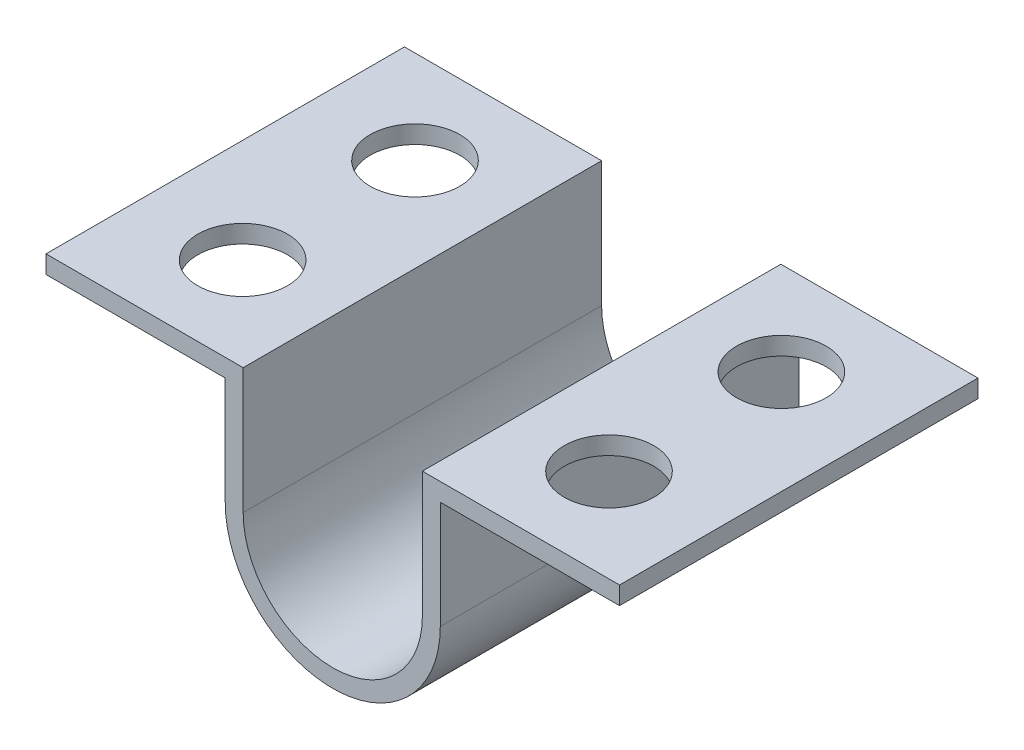
ISO-10303-21;
HEADER;
FILE_DESCRIPTION(('STEP AP214'),'2;1');
FILE_NAME('part.step','',(''),(''),'','','');
FILE_SCHEMA(('AUTOMOTIVE_DESIGN { 1 0 10303 214 1 1 1 1 }'));
ENDSEC;
DATA;
#1=APPLICATION_CONTEXT('core data for automotive mechanical design processes');
#2=APPLICATION_PROTOCOL_DEFINITION('international standard','automotive_design',2000,#1);
#3=PRODUCT_CONTEXT('',#1,'mechanical');
#4=PRODUCT('Part','Part','',(#3));
#5=PRODUCT_RELATED_PRODUCT_CATEGORY('part','',(#4));
#6=PRODUCT_DEFINITION_FORMATION('','',#4);
#7=PRODUCT_DEFINITION_CONTEXT('part definition',#1,'design');
#8=PRODUCT_DEFINITION('design','',#6,#7);
#9=PRODUCT_DEFINITION_SHAPE('','',#8);
#10=(LENGTH_UNIT() NAMED_UNIT(*) SI_UNIT(.MILLI.,.METRE.));
#11=(NAMED_UNIT(*) PLANE_ANGLE_UNIT() SI_UNIT($,.RADIAN.));
#12=(NAMED_UNIT(*) SI_UNIT($,.STERADIAN.) SOLID_ANGLE_UNIT());
#13=UNCERTAINTY_MEASURE_WITH_UNIT(LENGTH_MEASURE(1.E-05),#10,'distance_accuracy_value','');
#14=(GEOMETRIC_REPRESENTATION_CONTEXT(3) GLOBAL_UNCERTAINTY_ASSIGNED_CONTEXT((#13)) GLOBAL_UNIT_ASSIGNED_CONTEXT((#10,
#11,#12)) REPRESENTATION_CONTEXT('',''));
#15=CARTESIAN_POINT('',(0.,0.,0.));
#16=DIRECTION('',(0.,0.,1.));
#17=DIRECTION('',(1.,0.,0.));
#18=AXIS2_PLACEMENT_3D('',#15,#16,#17);
#19=CARTESIAN_POINT('',(-11.,0.5,10.));
#20=DIRECTION('',(0.,-1.,0.));
#21=DIRECTION('',(1.,0.,0.));
#22=AXIS2_PLACEMENT_3D('',#19,#20,#21);
#23=PLANE('',#22);
#24=CARTESIAN_POINT('',(-13.1104213238898,0.5,7.40424635587817));
#25=DIRECTION('',(0.,-1.,0.));
#26=DIRECTION('',(0.,0.,-1.));
#27=AXIS2_PLACEMENT_3D('',#24,#25,#26);
#28=CIRCLE('',#27,1.25);
#29=CARTESIAN_POINT('',(-13.1104213238898,0.5,6.15424635587817));
#30=VERTEX_POINT('',#29);
#31=EDGE_CURVE('E314',#30,#30,#28,.T.);
#32=ORIENTED_EDGE('',*,*,#31,.T.);
#33=EDGE_LOOP('',(#32));
#34=FACE_BOUND('',#33,.T.);
#35=CARTESIAN_POINT('',(-13.1104213238898,0.5,2.59575364412183));
#36=DIRECTION('',(0.,1.,0.));
#37=DIRECTION('',(0.,0.,1.));
#38=AXIS2_PLACEMENT_3D('',#35,#36,#37);
#39=CIRCLE('',#38,1.25);
#40=CARTESIAN_POINT('',(-13.1104213238898,0.5,3.84575364412183));
#41=VERTEX_POINT('',#40);
#42=EDGE_CURVE('E172',#41,#41,#39,.T.);
#43=ORIENTED_EDGE('',*,*,#42,.F.);
#44=EDGE_LOOP('',(#43));
#45=FACE_BOUND('',#44,.T.);
#46=DIRECTION('',(-1.,0.,0.));
#47=VECTOR('',#46,1.);
#48=CARTESIAN_POINT('',(-11.,0.5,0.));
#49=LINE('',#48,#47);
#50=CARTESIAN_POINT('',(-10.5,0.5,0.));
#51=VERTEX_POINT('',#50);
#52=CARTESIAN_POINT('',(-16.,0.499999999999999,0.));
#53=VERTEX_POINT('',#52);
#54=EDGE_CURVE('E167',#51,#53,#49,.T.);
#55=ORIENTED_EDGE('',*,*,#54,.T.);
#56=DIRECTION('',(0.,0.,-1.));
#57=VECTOR('',#56,1.);
#58=CARTESIAN_POINT('',(-16.,0.499999999999999,10.));
#59=LINE('',#58,#57);
#60=CARTESIAN_POINT('',(-16.,0.499999999999999,10.));
#61=VERTEX_POINT('',#60);
#62=EDGE_CURVE('E11',#61,#53,#59,.T.);
#63=ORIENTED_EDGE('',*,*,#62,.F.);
#64=DIRECTION('',(-1.,0.,0.));
#65=VECTOR('',#64,1.);
#66=CARTESIAN_POINT('',(-11.,0.5,10.));
#67=LINE('',#66,#65);
#68=CARTESIAN_POINT('',(-10.5,0.5,10.));
#69=VERTEX_POINT('',#68);
#70=EDGE_CURVE('E111',#69,#61,#67,.T.);
#71=ORIENTED_EDGE('',*,*,#70,.F.);
#72=DIRECTION('',(0.,0.,-1.));
#73=VECTOR('',#72,1.);
#74=CARTESIAN_POINT('',(-10.5,0.5,10.));
#75=LINE('',#74,#73);
#76=EDGE_CURVE('E163',#69,#51,#75,.T.);
#77=ORIENTED_EDGE('',*,*,#76,.T.);
#78=EDGE_LOOP('',(#55,#63,#71,#77));
#79=FACE_BOUND('',#78,.T.);
#80=ADVANCED_FACE('F42',(#34,#45,#79),#23,.F.);
#81=CARTESIAN_POINT('',(-16.,0.,10.));
#82=DIRECTION('',(-1.,0.,0.));
#83=DIRECTION('',(0.,0.,1.));
#84=AXIS2_PLACEMENT_3D('',#81,#82,#83);
#85=PLANE('',#84);
#86=DIRECTION('',(0.,1.,0.));
#87=VECTOR('',#86,1.);
#88=CARTESIAN_POINT('',(-16.,0.,0.));
#89=LINE('',#88,#87);
#90=CARTESIAN_POINT('',(-16.,0.,0.));
#91=VERTEX_POINT('',#90);
#92=EDGE_CURVE('E171',#91,#53,#89,.T.);
#93=ORIENTED_EDGE('',*,*,#92,.F.);
#94=DIRECTION('',(0.,0.,-1.));
#95=VECTOR('',#94,1.);
#96=CARTESIAN_POINT('',(-16.,0.,10.));
#97=LINE('',#96,#95);
#98=CARTESIAN_POINT('',(-16.,0.,10.));
#99=VERTEX_POINT('',#98);
#100=EDGE_CURVE('E51',#99,#91,#97,.T.);
#101=ORIENTED_EDGE('',*,*,#100,.F.);
#102=DIRECTION('',(0.,1.,0.));
#103=VECTOR('',#102,1.);
#104=CARTESIAN_POINT('',(-16.,0.,10.));
#105=LINE('',#104,#103);
#106=EDGE_CURVE('E255',#99,#61,#105,.T.);
#107=ORIENTED_EDGE('',*,*,#106,.T.);
#108=ORIENTED_EDGE('',*,*,#62,.T.);
#109=EDGE_LOOP('',(#93,#101,#107,#108));
#110=FACE_BOUND('',#109,.T.);
#111=ADVANCED_FACE('F242',(#110),#85,.T.);
#112=CARTESIAN_POINT('',(-11.,0.,10.));
#113=DIRECTION('',(0.,-1.,0.));
#114=DIRECTION('',(1.,0.,0.));
#115=AXIS2_PLACEMENT_3D('',#112,#113,#114);
#116=PLANE('',#115);
#117=CARTESIAN_POINT('',(-13.1104213238898,0.,7.40424635587817));
#118=DIRECTION('',(0.,-1.,0.));
#119=DIRECTION('',(0.,0.,-1.));
#120=AXIS2_PLACEMENT_3D('',#117,#118,#119);
#121=CIRCLE('',#120,1.25);
#122=CARTESIAN_POINT('',(-13.1104213238898,0.,6.15424635587817));
#123=VERTEX_POINT('',#122);
#124=EDGE_CURVE('E362',#123,#123,#121,.T.);
#125=ORIENTED_EDGE('',*,*,#124,.F.);
#126=EDGE_LOOP('',(#125));
#127=FACE_BOUND('',#126,.T.);
#128=CARTESIAN_POINT('',(-13.1104213238898,0.,2.59575364412183));
#129=DIRECTION('',(0.,1.,0.));
#130=DIRECTION('',(0.,0.,1.));
#131=AXIS2_PLACEMENT_3D('',#128,#129,#130);
#132=CIRCLE('',#131,1.25);
#133=CARTESIAN_POINT('',(-13.1104213238898,0.,3.84575364412183));
#134=VERTEX_POINT('',#133);
#135=EDGE_CURVE('E368',#134,#134,#132,.T.);
#136=ORIENTED_EDGE('',*,*,#135,.T.);
#137=EDGE_LOOP('',(#136));
#138=FACE_BOUND('',#137,.T.);
#139=DIRECTION('',(-1.,0.,0.));
#140=VECTOR('',#139,1.);
#141=CARTESIAN_POINT('',(-11.,0.,0.));
#142=LINE('',#141,#140);
#143=CARTESIAN_POINT('',(-11.,0.,0.));
#144=VERTEX_POINT('',#143);
#145=EDGE_CURVE('E176',#144,#91,#142,.T.);
#146=ORIENTED_EDGE('',*,*,#145,.F.);
#147=DIRECTION('',(0.,0.,-1.));
#148=VECTOR('',#147,1.);
#149=CARTESIAN_POINT('',(-11.,0.,10.));
#150=LINE('',#149,#148);
#151=CARTESIAN_POINT('',(-11.,0.,10.));
#152=VERTEX_POINT('',#151);
#153=EDGE_CURVE('E230',#152,#144,#150,.T.);
#154=ORIENTED_EDGE('',*,*,#153,.F.);
#155=DIRECTION('',(-1.,0.,0.));
#156=VECTOR('',#155,1.);
#157=CARTESIAN_POINT('',(-11.,0.,10.));
#158=LINE('',#157,#156);
#159=EDGE_CURVE('E239',#152,#99,#158,.T.);
#160=ORIENTED_EDGE('',*,*,#159,.T.);
#161=ORIENTED_EDGE('',*,*,#100,.T.);
#162=EDGE_LOOP('',(#146,#154,#160,#161));
#163=FACE_BOUND('',#162,.T.);
#164=ADVANCED_FACE('F237',(#127,#138,#163),#116,.T.);
#165=CARTESIAN_POINT('',(-11.,-3.,10.));
#166=DIRECTION('',(-1.,0.,0.));
#167=DIRECTION('',(0.,0.,1.));
#168=AXIS2_PLACEMENT_3D('',#165,#166,#167);
#169=PLANE('',#168);
#170=DIRECTION('',(0.,1.,0.));
#171=VECTOR('',#170,1.);
#172=CARTESIAN_POINT('',(-11.,-3.,0.));
#173=LINE('',#172,#171);
#174=CARTESIAN_POINT('',(-11.,-3.,0.));
#175=VERTEX_POINT('',#174);
#176=EDGE_CURVE('E180',#175,#144,#173,.T.);
#177=ORIENTED_EDGE('',*,*,#176,.F.);
#178=DIRECTION('',(0.,0.,-1.));
#179=VECTOR('',#178,1.);
#180=CARTESIAN_POINT('',(-11.,-3.,10.));
#181=LINE('',#180,#179);
#182=CARTESIAN_POINT('',(-11.,-3.,10.));
#183=VERTEX_POINT('',#182);
#184=EDGE_CURVE('E227',#183,#175,#181,.T.);
#185=ORIENTED_EDGE('',*,*,#184,.F.);
#186=DIRECTION('',(0.,1.,0.));
#187=VECTOR('',#186,1.);
#188=CARTESIAN_POINT('',(-11.,-3.,10.));
#189=LINE('',#188,#187);
#190=EDGE_CURVE('E252',#183,#152,#189,.T.);
#191=ORIENTED_EDGE('',*,*,#190,.T.);
#192=ORIENTED_EDGE('',*,*,#153,.T.);
#193=EDGE_LOOP('',(#177,#185,#191,#192));
#194=FACE_BOUND('',#193,.T.);
#195=ADVANCED_FACE('F249',(#194),#169,.T.);
#196=CARTESIAN_POINT('',(-8.,-3.,10.));
#197=DIRECTION('',(0.,0.,-1.));
#198=DIRECTION('',(-1.,0.,0.));
#199=AXIS2_PLACEMENT_3D('',#196,#197,#198);
#200=CYLINDRICAL_SURFACE('',#199,3.);
#201=CARTESIAN_POINT('',(-8.,-3.,0.));
#202=DIRECTION('',(0.,0.,-1.));
#203=DIRECTION('',(-1.,0.,0.));
#204=AXIS2_PLACEMENT_3D('',#201,#202,#203);
#205=CIRCLE('',#204,3.);
#206=CARTESIAN_POINT('',(-5.,-3.,0.));
#207=VERTEX_POINT('',#206);
#208=EDGE_CURVE('E184',#207,#175,#205,.T.);
#209=ORIENTED_EDGE('',*,*,#208,.F.);
#210=DIRECTION('',(0.,0.,-1.));
#211=VECTOR('',#210,1.);
#212=CARTESIAN_POINT('',(-5.,-3.,10.));
#213=LINE('',#212,#211);
#214=CARTESIAN_POINT('',(-5.,-3.,10.));
#215=VERTEX_POINT('',#214);
#216=EDGE_CURVE('E224',#215,#207,#213,.T.);
#217=ORIENTED_EDGE('',*,*,#216,.F.);
#218=CARTESIAN_POINT('',(-8.,-3.,10.));
#219=DIRECTION('',(0.,0.,-1.));
#220=DIRECTION('',(-1.,0.,0.));
#221=AXIS2_PLACEMENT_3D('',#218,#219,#220);
#222=CIRCLE('',#221,3.);
#223=EDGE_CURVE('E260',#215,#183,#222,.T.);
#224=ORIENTED_EDGE('',*,*,#223,.T.);
#225=ORIENTED_EDGE('',*,*,#184,.T.);
#226=EDGE_LOOP('',(#209,#217,#224,#225));
#227=FACE_BOUND('',#226,.T.);
#228=ADVANCED_FACE('F385',(#227),#200,.T.);
#229=CARTESIAN_POINT('',(-5.,0.,10.));
#230=DIRECTION('',(1.,0.,0.));
#231=DIRECTION('',(0.,1.,0.));
#232=AXIS2_PLACEMENT_3D('',#229,#230,#231);
#233=PLANE('',#232);
#234=DIRECTION('',(0.,-1.,0.));
#235=VECTOR('',#234,1.);
#236=CARTESIAN_POINT('',(-5.,0.,0.));
#237=LINE('',#236,#235);
#238=CARTESIAN_POINT('',(-5.,0.,0.));
#239=VERTEX_POINT('',#238);
#240=EDGE_CURVE('E188',#239,#207,#237,.T.);
#241=ORIENTED_EDGE('',*,*,#240,.F.);
#242=DIRECTION('',(0.,0.,-1.));
#243=VECTOR('',#242,1.);
#244=CARTESIAN_POINT('',(-5.,0.,10.));
#245=LINE('',#244,#243);
#246=CARTESIAN_POINT('',(-5.,0.,10.));
#247=VERTEX_POINT('',#246);
#248=EDGE_CURVE('E221',#247,#239,#245,.T.);
#249=ORIENTED_EDGE('',*,*,#248,.F.);
#250=DIRECTION('',(0.,-1.,0.));
#251=VECTOR('',#250,1.);
#252=CARTESIAN_POINT('',(-5.,0.,10.));
#253=LINE('',#252,#251);
#254=EDGE_CURVE('E267',#247,#215,#253,.T.);
#255=ORIENTED_EDGE('',*,*,#254,.T.);
#256=ORIENTED_EDGE('',*,*,#216,.T.);
#257=EDGE_LOOP('',(#241,#249,#255,#256));
#258=FACE_BOUND('',#257,.T.);
#259=ADVANCED_FACE('F391',(#258),#233,.T.);
#260=CARTESIAN_POINT('',(0.,0.,10.));
#261=DIRECTION('',(0.,-1.,0.));
#262=DIRECTION('',(1.,0.,0.));
#263=AXIS2_PLACEMENT_3D('',#260,#261,#262);
#264=PLANE('',#263);
#265=CARTESIAN_POINT('',(-2.88957867611016,0.,7.40424635587817));
#266=DIRECTION('',(0.,1.,0.));
#267=DIRECTION('',(0.,0.,-1.));
#268=AXIS2_PLACEMENT_3D('',#265,#266,#267);
#269=CIRCLE('',#268,1.25);
#270=CARTESIAN_POINT('',(-2.88957867611016,0.,6.15424635587817));
#271=VERTEX_POINT('',#270);
#272=EDGE_CURVE('E350',#271,#271,#269,.T.);
#273=ORIENTED_EDGE('',*,*,#272,.T.);
#274=EDGE_LOOP('',(#273));
#275=FACE_BOUND('',#274,.T.);
#276=CARTESIAN_POINT('',(-2.88957867611016,0.,2.59575364412183));
#277=DIRECTION('',(0.,-1.,0.));
#278=DIRECTION('',(0.,0.,1.));
#279=AXIS2_PLACEMENT_3D('',#276,#277,#278);
#280=CIRCLE('',#279,1.25);
#281=CARTESIAN_POINT('',(-2.88957867611016,0.,3.84575364412183));
#282=VERTEX_POINT('',#281);
#283=EDGE_CURVE('E355',#282,#282,#280,.T.);
#284=ORIENTED_EDGE('',*,*,#283,.F.);
#285=EDGE_LOOP('',(#284));
#286=FACE_BOUND('',#285,.T.);
#287=DIRECTION('',(-1.,0.,0.));
#288=VECTOR('',#287,1.);
#289=CARTESIAN_POINT('',(0.,0.,0.));
#290=LINE('',#289,#288);
#291=CARTESIAN_POINT('',(0.,0.,0.));
#292=VERTEX_POINT('',#291);
#293=EDGE_CURVE('E192',#292,#239,#290,.T.);
#294=ORIENTED_EDGE('',*,*,#293,.F.);
#295=DIRECTION('',(0.,0.,-1.));
#296=VECTOR('',#295,1.);
#297=CARTESIAN_POINT('',(0.,0.,10.));
#298=LINE('',#297,#296);
#299=CARTESIAN_POINT('',(0.,0.,10.));
#300=VERTEX_POINT('',#299);
#301=EDGE_CURVE('E218',#300,#292,#298,.T.);
#302=ORIENTED_EDGE('',*,*,#301,.F.);
#303=DIRECTION('',(-1.,0.,0.));
#304=VECTOR('',#303,1.);
#305=CARTESIAN_POINT('',(0.,0.,10.));
#306=LINE('',#305,#304);
#307=EDGE_CURVE('E271',#300,#247,#306,.T.);
#308=ORIENTED_EDGE('',*,*,#307,.T.);
#309=ORIENTED_EDGE('',*,*,#248,.T.);
#310=EDGE_LOOP('',(#294,#302,#308,#309));
#311=FACE_BOUND('',#310,.T.);
#312=ADVANCED_FACE('F286',(#275,#286,#311),#264,.T.);
#313=CARTESIAN_POINT('',(0.,0.5,10.));
#314=DIRECTION('',(1.,0.,0.));
#315=DIRECTION('',(0.,1.,0.));
#316=AXIS2_PLACEMENT_3D('',#313,#314,#315);
#317=PLANE('',#316);
#318=DIRECTION('',(0.,-1.,0.));
#319=VECTOR('',#318,1.);
#320=CARTESIAN_POINT('',(0.,0.5,0.));
#321=LINE('',#320,#319);
#322=CARTESIAN_POINT('',(0.,0.5,0.));
#323=VERTEX_POINT('',#322);
#324=EDGE_CURVE('E196',#323,#292,#321,.T.);
#325=ORIENTED_EDGE('',*,*,#324,.F.);
#326=DIRECTION('',(0.,0.,-1.));
#327=VECTOR('',#326,1.);
#328=CARTESIAN_POINT('',(0.,0.5,10.));
#329=LINE('',#328,#327);
#330=CARTESIAN_POINT('',(0.,0.5,10.));
#331=VERTEX_POINT('',#330);
#332=EDGE_CURVE('E215',#331,#323,#329,.T.);
#333=ORIENTED_EDGE('',*,*,#332,.F.);
#334=DIRECTION('',(0.,-1.,0.));
#335=VECTOR('',#334,1.);
#336=CARTESIAN_POINT('',(0.,0.5,10.));
#337=LINE('',#336,#335);
#338=EDGE_CURVE('E275',#331,#300,#337,.T.);
#339=ORIENTED_EDGE('',*,*,#338,.T.);
#340=ORIENTED_EDGE('',*,*,#301,.T.);
#341=EDGE_LOOP('',(#325,#333,#339,#340));
#342=FACE_BOUND('',#341,.T.);
#343=ADVANCED_FACE('F281',(#342),#317,.T.);
#344=CARTESIAN_POINT('',(0.,0.5,10.));
#345=DIRECTION('',(0.,-1.,0.));
#346=DIRECTION('',(1.,0.,0.));
#347=AXIS2_PLACEMENT_3D('',#344,#345,#346);
#348=PLANE('',#347);
#349=CARTESIAN_POINT('',(-2.88957867611016,0.5,7.40424635587817));
#350=DIRECTION('',(0.,1.,0.));
#351=DIRECTION('',(0.,0.,-1.));
#352=AXIS2_PLACEMENT_3D('',#349,#350,#351);
#353=CIRCLE('',#352,1.25);
#354=CARTESIAN_POINT('',(-2.88957867611016,0.5,6.15424635587817));
#355=VERTEX_POINT('',#354);
#356=EDGE_CURVE('E347',#355,#355,#353,.T.);
#357=ORIENTED_EDGE('',*,*,#356,.F.);
#358=EDGE_LOOP('',(#357));
#359=FACE_BOUND('',#358,.T.);
#360=CARTESIAN_POINT('',(-2.88957867611016,0.5,2.59575364412183));
#361=DIRECTION('',(0.,-1.,0.));
#362=DIRECTION('',(0.,0.,1.));
#363=AXIS2_PLACEMENT_3D('',#360,#361,#362);
#364=CIRCLE('',#363,1.25);
#365=CARTESIAN_POINT('',(-2.88957867611016,0.5,3.84575364412183));
#366=VERTEX_POINT('',#365);
#367=EDGE_CURVE('E358',#366,#366,#364,.T.);
#368=ORIENTED_EDGE('',*,*,#367,.T.);
#369=EDGE_LOOP('',(#368));
#370=FACE_BOUND('',#369,.T.);
#371=DIRECTION('',(-1.,0.,0.));
#372=VECTOR('',#371,1.);
#373=CARTESIAN_POINT('',(0.,0.5,0.));
#374=LINE('',#373,#372);
#375=CARTESIAN_POINT('',(-5.5,0.499999999999999,0.));
#376=VERTEX_POINT('',#375);
#377=EDGE_CURVE('E200',#323,#376,#374,.T.);
#378=ORIENTED_EDGE('',*,*,#377,.T.);
#379=DIRECTION('',(0.,0.,-1.));
#380=VECTOR('',#379,1.);
#381=CARTESIAN_POINT('',(-5.5,0.499999999999999,10.));
#382=LINE('',#381,#380);
#383=CARTESIAN_POINT('',(-5.5,0.499999999999999,10.));
#384=VERTEX_POINT('',#383);
#385=EDGE_CURVE('E156',#384,#376,#382,.T.);
#386=ORIENTED_EDGE('',*,*,#385,.F.);
#387=DIRECTION('',(-1.,0.,0.));
#388=VECTOR('',#387,1.);
#389=CARTESIAN_POINT('',(0.,0.5,10.));
#390=LINE('',#389,#388);
#391=EDGE_CURVE('E145',#331,#384,#390,.T.);
#392=ORIENTED_EDGE('',*,*,#391,.F.);
#393=ORIENTED_EDGE('',*,*,#332,.T.);
#394=EDGE_LOOP('',(#378,#386,#392,#393));
#395=FACE_BOUND('',#394,.T.);
#396=ADVANCED_FACE('F290',(#359,#370,#395),#348,.F.);
#397=CARTESIAN_POINT('',(-5.5,0.,10.));
#398=DIRECTION('',(1.,0.,0.));
#399=DIRECTION('',(0.,1.,0.));
#400=AXIS2_PLACEMENT_3D('',#397,#398,#399);
#401=PLANE('',#400);
#402=DIRECTION('',(0.,-1.,0.));
#403=VECTOR('',#402,1.);
#404=CARTESIAN_POINT('',(-5.5,0.,0.));
#405=LINE('',#404,#403);
#406=CARTESIAN_POINT('',(-5.5,-3.,0.));
#407=VERTEX_POINT('',#406);
#408=EDGE_CURVE('E154',#376,#407,#405,.T.);
#409=ORIENTED_EDGE('',*,*,#408,.T.);
#410=DIRECTION('',(0.,0.,-1.));
#411=VECTOR('',#410,1.);
#412=CARTESIAN_POINT('',(-5.5,-3.,10.));
#413=LINE('',#412,#411);
#414=CARTESIAN_POINT('',(-5.5,-3.,10.));
#415=VERTEX_POINT('',#414);
#416=EDGE_CURVE('E151',#415,#407,#413,.T.);
#417=ORIENTED_EDGE('',*,*,#416,.F.);
#418=DIRECTION('',(0.,-1.,0.));
#419=VECTOR('',#418,1.);
#420=CARTESIAN_POINT('',(-5.5,0.,10.));
#421=LINE('',#420,#419);
#422=EDGE_CURVE('E138',#384,#415,#421,.T.);
#423=ORIENTED_EDGE('',*,*,#422,.F.);
#424=ORIENTED_EDGE('',*,*,#385,.T.);
#425=EDGE_LOOP('',(#409,#417,#423,#424));
#426=FACE_BOUND('',#425,.T.);
#427=ADVANCED_FACE('F152',(#426),#401,.F.);
#428=CARTESIAN_POINT('',(-8.,-3.,10.));
#429=DIRECTION('',(0.,0.,-1.));
#430=DIRECTION('',(-1.,0.,0.));
#431=AXIS2_PLACEMENT_3D('',#428,#429,#430);
#432=CYLINDRICAL_SURFACE('',#431,2.5);
#433=CARTESIAN_POINT('',(-8.,-3.,0.));
#434=DIRECTION('',(0.,0.,1.));
#435=DIRECTION('',(1.,0.,0.));
#436=AXIS2_PLACEMENT_3D('',#433,#434,#435);
#437=CIRCLE('',#436,2.5);
#438=CARTESIAN_POINT('',(-10.5,-3.,0.));
#439=VERTEX_POINT('',#438);
#440=EDGE_CURVE('E99',#407,#439,#437,.F.);
#441=ORIENTED_EDGE('',*,*,#440,.T.);
#442=DIRECTION('',(0.,0.,-1.));
#443=VECTOR('',#442,1.);
#444=CARTESIAN_POINT('',(-10.5,-3.,10.));
#445=LINE('',#444,#443);
#446=CARTESIAN_POINT('',(-10.5,-3.,10.));
#447=VERTEX_POINT('',#446);
#448=EDGE_CURVE('E157',#447,#439,#445,.T.);
#449=ORIENTED_EDGE('',*,*,#448,.F.);
#450=CARTESIAN_POINT('',(-8.,-3.,10.));
#451=DIRECTION('',(0.,0.,1.));
#452=DIRECTION('',(1.,0.,0.));
#453=AXIS2_PLACEMENT_3D('',#450,#451,#452);
#454=CIRCLE('',#453,2.5);
#455=EDGE_CURVE('E142',#415,#447,#454,.F.);
#456=ORIENTED_EDGE('',*,*,#455,.F.);
#457=ORIENTED_EDGE('',*,*,#416,.T.);
#458=EDGE_LOOP('',(#441,#449,#456,#457));
#459=FACE_BOUND('',#458,.T.);
#460=ADVANCED_FACE('F159',(#459),#432,.F.);
#461=CARTESIAN_POINT('',(-10.5,-3.,10.));
#462=DIRECTION('',(-1.,0.,0.));
#463=DIRECTION('',(0.,0.,1.));
#464=AXIS2_PLACEMENT_3D('',#461,#462,#463);
#465=PLANE('',#464);
#466=DIRECTION('',(0.,1.,0.));
#467=VECTOR('',#466,1.);
#468=CARTESIAN_POINT('',(-10.5,-3.,0.));
#469=LINE('',#468,#467);
#470=EDGE_CURVE('E105',#439,#51,#469,.T.);
#471=ORIENTED_EDGE('',*,*,#470,.T.);
#472=ORIENTED_EDGE('',*,*,#76,.F.);
#473=DIRECTION('',(0.,1.,0.));
#474=VECTOR('',#473,1.);
#475=CARTESIAN_POINT('',(-10.5,-3.,10.));
#476=LINE('',#475,#474);
#477=EDGE_CURVE('E59',#447,#69,#476,.T.);
#478=ORIENTED_EDGE('',*,*,#477,.F.);
#479=ORIENTED_EDGE('',*,*,#448,.T.);
#480=EDGE_LOOP('',(#471,#472,#478,#479));
#481=FACE_BOUND('',#480,.T.);
#482=ADVANCED_FACE('F318',(#481),#465,.F.);
#483=CARTESIAN_POINT('',(-8.,-3.,10.));
#484=DIRECTION('',(0.,0.,-1.));
#485=DIRECTION('',(-1.,0.,0.));
#486=AXIS2_PLACEMENT_3D('',#483,#484,#485);
#487=PLANE('',#486);
#488=ORIENTED_EDGE('',*,*,#70,.T.);
#489=ORIENTED_EDGE('',*,*,#106,.F.);
#490=ORIENTED_EDGE('',*,*,#159,.F.);
#491=ORIENTED_EDGE('',*,*,#190,.F.);
#492=ORIENTED_EDGE('',*,*,#223,.F.);
#493=ORIENTED_EDGE('',*,*,#254,.F.);
#494=ORIENTED_EDGE('',*,*,#307,.F.);
#495=ORIENTED_EDGE('',*,*,#338,.F.);
#496=ORIENTED_EDGE('',*,*,#391,.T.);
#497=ORIENTED_EDGE('',*,*,#422,.T.);
#498=ORIENTED_EDGE('',*,*,#455,.T.);
#499=ORIENTED_EDGE('',*,*,#477,.T.);
#500=EDGE_LOOP('',(#488,#489,#490,#491,#492,#493,#494,#495,#496,#497,#498,#499));
#501=FACE_BOUND('',#500,.T.);
#502=ADVANCED_FACE('F140',(#501),#487,.F.);
#503=CARTESIAN_POINT('',(-8.,-3.,0.));
#504=DIRECTION('',(0.,0.,-1.));
#505=DIRECTION('',(-1.,0.,0.));
#506=AXIS2_PLACEMENT_3D('',#503,#504,#505);
#507=PLANE('',#506);
#508=ORIENTED_EDGE('',*,*,#54,.F.);
#509=ORIENTED_EDGE('',*,*,#470,.F.);
#510=ORIENTED_EDGE('',*,*,#440,.F.);
#511=ORIENTED_EDGE('',*,*,#408,.F.);
#512=ORIENTED_EDGE('',*,*,#377,.F.);
#513=ORIENTED_EDGE('',*,*,#324,.T.);
#514=ORIENTED_EDGE('',*,*,#293,.T.);
#515=ORIENTED_EDGE('',*,*,#240,.T.);
#516=ORIENTED_EDGE('',*,*,#208,.T.);
#517=ORIENTED_EDGE('',*,*,#176,.T.);
#518=ORIENTED_EDGE('',*,*,#145,.T.);
#519=ORIENTED_EDGE('',*,*,#92,.T.);
#520=EDGE_LOOP('',(#508,#509,#510,#511,#512,#513,#514,#515,#516,#517,#518,#519));
#521=FACE_BOUND('',#520,.T.);
#522=ADVANCED_FACE('F245',(#521),#507,.T.);
#523=CARTESIAN_POINT('',(-13.1104213238898,0.5,2.59575364412183));
#524=DIRECTION('',(0.,-1.,0.));
#525=DIRECTION('',(0.,0.,-1.));
#526=AXIS2_PLACEMENT_3D('',#523,#524,#525);
#527=CYLINDRICAL_SURFACE('',#526,1.25);
#528=ORIENTED_EDGE('',*,*,#42,.T.);
#529=EDGE_LOOP('',(#528));
#530=FACE_BOUND('',#529,.T.);
#531=ORIENTED_EDGE('',*,*,#135,.F.);
#532=EDGE_LOOP('',(#531));
#533=FACE_BOUND('',#532,.T.);
#534=ADVANCED_FACE('F329',(#530,#533),#527,.F.);
#535=CARTESIAN_POINT('',(-13.1104213238898,0.5,7.40424635587817));
#536=DIRECTION('',(0.,-1.,0.));
#537=DIRECTION('',(0.,0.,-1.));
#538=AXIS2_PLACEMENT_3D('',#535,#536,#537);
#539=CYLINDRICAL_SURFACE('',#538,1.25);
#540=ORIENTED_EDGE('',*,*,#31,.F.);
#541=EDGE_LOOP('',(#540));
#542=FACE_BOUND('',#541,.T.);
#543=ORIENTED_EDGE('',*,*,#124,.T.);
#544=EDGE_LOOP('',(#543));
#545=FACE_BOUND('',#544,.T.);
#546=ADVANCED_FACE('F332',(#542,#545),#539,.F.);
#547=CARTESIAN_POINT('',(-2.88957867611016,0.5,2.59575364412183));
#548=DIRECTION('',(0.,-1.,0.));
#549=DIRECTION('',(0.,0.,-1.));
#550=AXIS2_PLACEMENT_3D('',#547,#548,#549);
#551=CYLINDRICAL_SURFACE('',#550,1.25);
#552=ORIENTED_EDGE('',*,*,#367,.F.);
#553=EDGE_LOOP('',(#552));
#554=FACE_BOUND('',#553,.T.);
#555=ORIENTED_EDGE('',*,*,#283,.T.);
#556=EDGE_LOOP('',(#555));
#557=FACE_BOUND('',#556,.T.);
#558=ADVANCED_FACE('F336',(#554,#557),#551,.F.);
#559=CARTESIAN_POINT('',(-2.88957867611016,0.5,7.40424635587817));
#560=DIRECTION('',(0.,-1.,0.));
#561=DIRECTION('',(0.,0.,-1.));
#562=AXIS2_PLACEMENT_3D('',#559,#560,#561);
#563=CYLINDRICAL_SURFACE('',#562,1.25);
#564=ORIENTED_EDGE('',*,*,#356,.T.);
#565=EDGE_LOOP('',(#564));
#566=FACE_BOUND('',#565,.T.);
#567=ORIENTED_EDGE('',*,*,#272,.F.);
#568=EDGE_LOOP('',(#567));
#569=FACE_BOUND('',#568,.T.);
#570=ADVANCED_FACE('F339',(#566,#569),#563,.F.);
#571=CLOSED_SHELL('',(#80,#111,#164,#195,#228,#259,#312,#343,#396,#427,#460,#482,#502,#522,#534,
#546,#558,#570));
#572=MANIFOLD_SOLID_BREP('B2',#571);
#573=ADVANCED_BREP_SHAPE_REPRESENTATION('',(#18,#572),#14);
#574=SHAPE_DEFINITION_REPRESENTATION(#9,#573);
ENDSEC;
END-ISO-10303-21;
